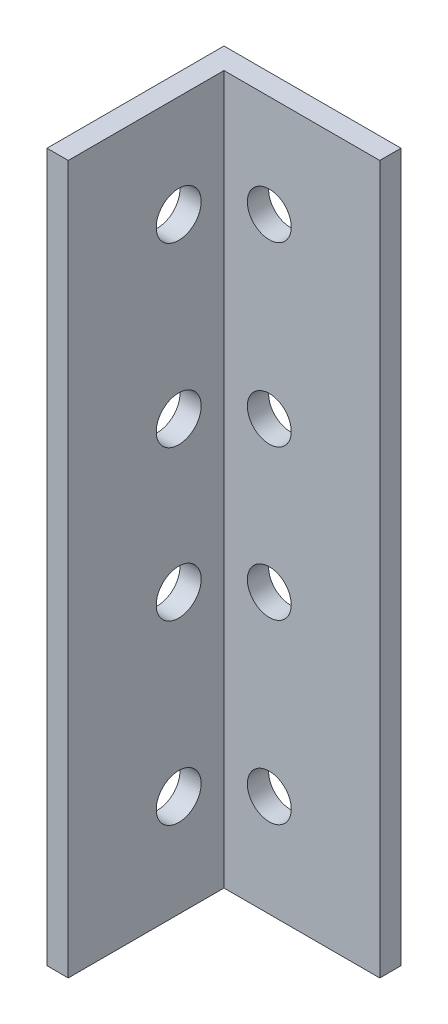
ISO-10303-21;
HEADER;
FILE_DESCRIPTION(('STEP AP214'),'2;1');
FILE_NAME('part.step','',(''),(''),'','','');
FILE_SCHEMA(('AUTOMOTIVE_DESIGN { 1 0 10303 214 1 1 1 1 }'));
ENDSEC;
DATA;
#1=APPLICATION_CONTEXT('core data for automotive mechanical design processes');
#2=APPLICATION_PROTOCOL_DEFINITION('international standard','automotive_design',2000,#1);
#3=PRODUCT_CONTEXT('',#1,'mechanical');
#4=PRODUCT('Part','Part','',(#3));
#5=PRODUCT_RELATED_PRODUCT_CATEGORY('part','',(#4));
#6=PRODUCT_DEFINITION_FORMATION('','',#4);
#7=PRODUCT_DEFINITION_CONTEXT('part definition',#1,'design');
#8=PRODUCT_DEFINITION('design','',#6,#7);
#9=PRODUCT_DEFINITION_SHAPE('','',#8);
#10=(LENGTH_UNIT() NAMED_UNIT(*) SI_UNIT(.MILLI.,.METRE.));
#11=(NAMED_UNIT(*) PLANE_ANGLE_UNIT() SI_UNIT($,.RADIAN.));
#12=(NAMED_UNIT(*) SI_UNIT($,.STERADIAN.) SOLID_ANGLE_UNIT());
#13=UNCERTAINTY_MEASURE_WITH_UNIT(LENGTH_MEASURE(1.E-05),#10,'distance_accuracy_value','');
#14=(GEOMETRIC_REPRESENTATION_CONTEXT(3) GLOBAL_UNCERTAINTY_ASSIGNED_CONTEXT((#13)) GLOBAL_UNIT_ASSIGNED_CONTEXT((#10,
#11,#12)) REPRESENTATION_CONTEXT('',''));
#15=CARTESIAN_POINT('',(0.,0.,0.));
#16=DIRECTION('',(0.,0.,1.));
#17=DIRECTION('',(1.,0.,0.));
#18=AXIS2_PLACEMENT_3D('',#15,#16,#17);
#19=CARTESIAN_POINT('',(-192.,50.,-225.));
#20=DIRECTION('',(0.,-1.,0.));
#21=DIRECTION('',(0.,0.,-1.));
#22=AXIS2_PLACEMENT_3D('',#19,#20,#21);
#23=PLANE('',#22);
#24=DIRECTION('',(-1.,0.,0.));
#25=VECTOR('',#24,1.);
#26=CARTESIAN_POINT('',(-200.,50.,-220.));
#27=LINE('',#26,#25);
#28=CARTESIAN_POINT('',(-170.,50.,-220.));
#29=VERTEX_POINT('',#28);
#30=CARTESIAN_POINT('',(-195.,50.,-220.));
#31=VERTEX_POINT('',#30);
#32=EDGE_CURVE('E157',#29,#31,#27,.T.);
#33=ORIENTED_EDGE('',*,*,#32,.T.);
#34=DIRECTION('',(0.,0.,1.));
#35=VECTOR('',#34,1.);
#36=CARTESIAN_POINT('',(-195.,50.,-225.));
#37=LINE('',#36,#35);
#38=CARTESIAN_POINT('',(-195.,50.,-195.));
#39=VERTEX_POINT('',#38);
#40=EDGE_CURVE('E87',#31,#39,#37,.T.);
#41=ORIENTED_EDGE('',*,*,#40,.T.);
#42=DIRECTION('',(-1.,0.,0.));
#43=VECTOR('',#42,1.);
#44=CARTESIAN_POINT('',(-192.,50.,-195.));
#45=LINE('',#44,#43);
#46=CARTESIAN_POINT('',(-192.,50.,-195.));
#47=VERTEX_POINT('',#46);
#48=EDGE_CURVE('E11',#47,#39,#45,.T.);
#49=ORIENTED_EDGE('',*,*,#48,.F.);
#50=DIRECTION('',(0.,0.,1.));
#51=VECTOR('',#50,1.);
#52=CARTESIAN_POINT('',(-192.,50.,-225.));
#53=LINE('',#52,#51);
#54=CARTESIAN_POINT('',(-192.,50.,-217.));
#55=VERTEX_POINT('',#54);
#56=EDGE_CURVE('E102',#55,#47,#53,.T.);
#57=ORIENTED_EDGE('',*,*,#56,.F.);
#58=DIRECTION('',(-1.,0.,0.));
#59=VECTOR('',#58,1.);
#60=CARTESIAN_POINT('',(-200.,50.,-217.));
#61=LINE('',#60,#59);
#62=CARTESIAN_POINT('',(-170.,50.,-217.));
#63=VERTEX_POINT('',#62);
#64=EDGE_CURVE('E156',#63,#55,#61,.T.);
#65=ORIENTED_EDGE('',*,*,#64,.F.);
#66=DIRECTION('',(0.,0.,-1.));
#67=VECTOR('',#66,1.);
#68=CARTESIAN_POINT('',(-170.,50.,-217.));
#69=LINE('',#68,#67);
#70=EDGE_CURVE('E152',#63,#29,#69,.T.);
#71=ORIENTED_EDGE('',*,*,#70,.T.);
#72=EDGE_LOOP('',(#33,#41,#49,#57,#65,#71));
#73=FACE_BOUND('',#72,.T.);
#74=ADVANCED_FACE('F45',(#73),#23,.F.);
#75=CARTESIAN_POINT('',(-192.,-50.,-225.));
#76=DIRECTION('',(0.,1.,0.));
#77=DIRECTION('',(0.,0.,1.));
#78=AXIS2_PLACEMENT_3D('',#75,#76,#77);
#79=PLANE('',#78);
#80=DIRECTION('',(0.,0.,-1.));
#81=VECTOR('',#80,1.);
#82=CARTESIAN_POINT('',(-195.,-50.,-225.));
#83=LINE('',#82,#81);
#84=CARTESIAN_POINT('',(-195.,-50.,-195.));
#85=VERTEX_POINT('',#84);
#86=CARTESIAN_POINT('',(-195.,-50.,-220.));
#87=VERTEX_POINT('',#86);
#88=EDGE_CURVE('E86',#85,#87,#83,.T.);
#89=ORIENTED_EDGE('',*,*,#88,.T.);
#90=DIRECTION('',(1.,0.,0.));
#91=VECTOR('',#90,1.);
#92=CARTESIAN_POINT('',(-200.,-50.,-220.));
#93=LINE('',#92,#91);
#94=CARTESIAN_POINT('',(-170.,-50.,-220.));
#95=VERTEX_POINT('',#94);
#96=EDGE_CURVE('E166',#87,#95,#93,.T.);
#97=ORIENTED_EDGE('',*,*,#96,.T.);
#98=DIRECTION('',(0.,0.,-1.));
#99=VECTOR('',#98,1.);
#100=CARTESIAN_POINT('',(-170.,-50.,-217.));
#101=LINE('',#100,#99);
#102=CARTESIAN_POINT('',(-170.,-50.,-217.));
#103=VERTEX_POINT('',#102);
#104=EDGE_CURVE('E148',#103,#95,#101,.T.);
#105=ORIENTED_EDGE('',*,*,#104,.F.);
#106=DIRECTION('',(1.,0.,0.));
#107=VECTOR('',#106,1.);
#108=CARTESIAN_POINT('',(-200.,-50.,-217.));
#109=LINE('',#108,#107);
#110=CARTESIAN_POINT('',(-192.,-50.,-217.));
#111=VERTEX_POINT('',#110);
#112=EDGE_CURVE('E161',#111,#103,#109,.T.);
#113=ORIENTED_EDGE('',*,*,#112,.F.);
#114=DIRECTION('',(0.,0.,-1.));
#115=VECTOR('',#114,1.);
#116=CARTESIAN_POINT('',(-192.,-50.,-225.));
#117=LINE('',#116,#115);
#118=CARTESIAN_POINT('',(-192.,-50.,-195.));
#119=VERTEX_POINT('',#118);
#120=EDGE_CURVE('E60',#119,#111,#117,.T.);
#121=ORIENTED_EDGE('',*,*,#120,.F.);
#122=DIRECTION('',(-1.,0.,0.));
#123=VECTOR('',#122,1.);
#124=CARTESIAN_POINT('',(-192.,-50.,-195.));
#125=LINE('',#124,#123);
#126=EDGE_CURVE('E53',#119,#85,#125,.T.);
#127=ORIENTED_EDGE('',*,*,#126,.T.);
#128=EDGE_LOOP('',(#89,#97,#105,#113,#121,#127));
#129=FACE_BOUND('',#128,.T.);
#130=ADVANCED_FACE('F91',(#129),#79,.F.);
#131=CARTESIAN_POINT('',(-192.,0.,0.));
#132=DIRECTION('',(-1.,0.,0.));
#133=DIRECTION('',(0.,0.,1.));
#134=AXIS2_PLACEMENT_3D('',#131,#132,#133);
#135=PLANE('',#134);
#136=CARTESIAN_POINT('',(-192.,-35.6,-210.6));
#137=DIRECTION('',(1.,0.,0.));
#138=DIRECTION('',(0.,0.,-1.));
#139=AXIS2_PLACEMENT_3D('',#136,#137,#138);
#140=CIRCLE('',#139,3.175);
#141=CARTESIAN_POINT('',(-192.,-35.6,-213.775));
#142=VERTEX_POINT('',#141);
#143=EDGE_CURVE('E109',#142,#142,#140,.T.);
#144=ORIENTED_EDGE('',*,*,#143,.F.);
#145=EDGE_LOOP('',(#144));
#146=FACE_BOUND('',#145,.T.);
#147=CARTESIAN_POINT('',(-192.,-10.6,-210.6));
#148=DIRECTION('',(1.,0.,0.));
#149=DIRECTION('',(0.,0.,-1.));
#150=AXIS2_PLACEMENT_3D('',#147,#148,#149);
#151=CIRCLE('',#150,3.175);
#152=CARTESIAN_POINT('',(-192.,-10.6,-213.775));
#153=VERTEX_POINT('',#152);
#154=EDGE_CURVE('E118',#153,#153,#151,.T.);
#155=ORIENTED_EDGE('',*,*,#154,.F.);
#156=EDGE_LOOP('',(#155));
#157=FACE_BOUND('',#156,.T.);
#158=CARTESIAN_POINT('',(-192.,10.6,-210.6));
#159=DIRECTION('',(1.,0.,0.));
#160=DIRECTION('',(0.,0.,-1.));
#161=AXIS2_PLACEMENT_3D('',#158,#159,#160);
#162=CIRCLE('',#161,3.175);
#163=CARTESIAN_POINT('',(-192.,10.6,-213.775));
#164=VERTEX_POINT('',#163);
#165=EDGE_CURVE('E126',#164,#164,#162,.T.);
#166=ORIENTED_EDGE('',*,*,#165,.F.);
#167=EDGE_LOOP('',(#166));
#168=FACE_BOUND('',#167,.T.);
#169=CARTESIAN_POINT('',(-192.,35.6,-210.6));
#170=DIRECTION('',(1.,0.,0.));
#171=DIRECTION('',(0.,0.,-1.));
#172=AXIS2_PLACEMENT_3D('',#169,#170,#171);
#173=CIRCLE('',#172,3.175);
#174=CARTESIAN_POINT('',(-192.,35.6,-213.775));
#175=VERTEX_POINT('',#174);
#176=EDGE_CURVE('E134',#175,#175,#173,.T.);
#177=ORIENTED_EDGE('',*,*,#176,.F.);
#178=EDGE_LOOP('',(#177));
#179=FACE_BOUND('',#178,.T.);
#180=DIRECTION('',(0.,-1.,0.));
#181=VECTOR('',#180,1.);
#182=CARTESIAN_POINT('',(-192.,0.,-217.));
#183=LINE('',#182,#181);
#184=EDGE_CURVE('E142',#55,#111,#183,.T.);
#185=ORIENTED_EDGE('',*,*,#184,.F.);
#186=ORIENTED_EDGE('',*,*,#56,.T.);
#187=DIRECTION('',(0.,-1.,0.));
#188=VECTOR('',#187,1.);
#189=CARTESIAN_POINT('',(-192.,50.,-195.));
#190=LINE('',#189,#188);
#191=EDGE_CURVE('E66',#47,#119,#190,.T.);
#192=ORIENTED_EDGE('',*,*,#191,.T.);
#193=ORIENTED_EDGE('',*,*,#120,.T.);
#194=EDGE_LOOP('',(#185,#186,#192,#193));
#195=FACE_BOUND('',#194,.T.);
#196=ADVANCED_FACE('F262',(#146,#157,#168,#179,#195),#135,.F.);
#197=CARTESIAN_POINT('',(-195.,0.,0.));
#198=DIRECTION('',(-1.,0.,0.));
#199=DIRECTION('',(0.,0.,1.));
#200=AXIS2_PLACEMENT_3D('',#197,#198,#199);
#201=PLANE('',#200);
#202=DIRECTION('',(0.,-1.,0.));
#203=VECTOR('',#202,1.);
#204=CARTESIAN_POINT('',(-195.,70.,-220.));
#205=LINE('',#204,#203);
#206=EDGE_CURVE('E100',#31,#87,#205,.T.);
#207=ORIENTED_EDGE('',*,*,#206,.T.);
#208=ORIENTED_EDGE('',*,*,#88,.F.);
#209=DIRECTION('',(0.,-1.,0.));
#210=VECTOR('',#209,1.);
#211=CARTESIAN_POINT('',(-195.,50.,-195.));
#212=LINE('',#211,#210);
#213=EDGE_CURVE('E78',#39,#85,#212,.T.);
#214=ORIENTED_EDGE('',*,*,#213,.F.);
#215=ORIENTED_EDGE('',*,*,#40,.F.);
#216=EDGE_LOOP('',(#207,#208,#214,#215));
#217=FACE_BOUND('',#216,.T.);
#218=CARTESIAN_POINT('',(-195.,10.6,-210.6));
#219=DIRECTION('',(1.,0.,0.));
#220=DIRECTION('',(0.,0.,-1.));
#221=AXIS2_PLACEMENT_3D('',#218,#219,#220);
#222=CIRCLE('',#221,3.175);
#223=CARTESIAN_POINT('',(-195.,10.6,-213.775));
#224=VERTEX_POINT('',#223);
#225=EDGE_CURVE('E130',#224,#224,#222,.T.);
#226=ORIENTED_EDGE('',*,*,#225,.T.);
#227=EDGE_LOOP('',(#226));
#228=FACE_BOUND('',#227,.T.);
#229=CARTESIAN_POINT('',(-195.,-35.6,-210.6));
#230=DIRECTION('',(1.,0.,0.));
#231=DIRECTION('',(0.,0.,-1.));
#232=AXIS2_PLACEMENT_3D('',#229,#230,#231);
#233=CIRCLE('',#232,3.175);
#234=CARTESIAN_POINT('',(-195.,-35.6,-213.775));
#235=VERTEX_POINT('',#234);
#236=EDGE_CURVE('E114',#235,#235,#233,.T.);
#237=ORIENTED_EDGE('',*,*,#236,.T.);
#238=EDGE_LOOP('',(#237));
#239=FACE_BOUND('',#238,.T.);
#240=CARTESIAN_POINT('',(-195.,-10.6,-210.6));
#241=DIRECTION('',(1.,0.,0.));
#242=DIRECTION('',(0.,0.,-1.));
#243=AXIS2_PLACEMENT_3D('',#240,#241,#242);
#244=CIRCLE('',#243,3.175);
#245=CARTESIAN_POINT('',(-195.,-10.6,-213.775));
#246=VERTEX_POINT('',#245);
#247=EDGE_CURVE('E122',#246,#246,#244,.T.);
#248=ORIENTED_EDGE('',*,*,#247,.T.);
#249=EDGE_LOOP('',(#248));
#250=FACE_BOUND('',#249,.T.);
#251=CARTESIAN_POINT('',(-195.,35.6,-210.6));
#252=DIRECTION('',(1.,0.,0.));
#253=DIRECTION('',(0.,0.,-1.));
#254=AXIS2_PLACEMENT_3D('',#251,#252,#253);
#255=CIRCLE('',#254,3.175);
#256=CARTESIAN_POINT('',(-195.,35.6,-213.775));
#257=VERTEX_POINT('',#256);
#258=EDGE_CURVE('E138',#257,#257,#255,.T.);
#259=ORIENTED_EDGE('',*,*,#258,.T.);
#260=EDGE_LOOP('',(#259));
#261=FACE_BOUND('',#260,.T.);
#262=ADVANCED_FACE('F97',(#217,#228,#239,#250,#261),#201,.T.);
#263=CARTESIAN_POINT('',(-192.,50.,-195.));
#264=DIRECTION('',(0.,0.,-1.));
#265=DIRECTION('',(0.,1.,0.));
#266=AXIS2_PLACEMENT_3D('',#263,#264,#265);
#267=PLANE('',#266);
#268=ORIENTED_EDGE('',*,*,#213,.T.);
#269=ORIENTED_EDGE('',*,*,#126,.F.);
#270=ORIENTED_EDGE('',*,*,#191,.F.);
#271=ORIENTED_EDGE('',*,*,#48,.T.);
#272=EDGE_LOOP('',(#268,#269,#270,#271));
#273=FACE_BOUND('',#272,.T.);
#274=ADVANCED_FACE('F80',(#273),#267,.F.);
#275=CARTESIAN_POINT('',(-192.,-35.6,-210.6));
#276=DIRECTION('',(-1.,0.,0.));
#277=DIRECTION('',(0.,0.,1.));
#278=AXIS2_PLACEMENT_3D('',#275,#276,#277);
#279=CYLINDRICAL_SURFACE('',#278,3.175);
#280=ORIENTED_EDGE('',*,*,#143,.T.);
#281=EDGE_LOOP('',(#280));
#282=FACE_BOUND('',#281,.T.);
#283=ORIENTED_EDGE('',*,*,#236,.F.);
#284=EDGE_LOOP('',(#283));
#285=FACE_BOUND('',#284,.T.);
#286=ADVANCED_FACE('F271',(#282,#285),#279,.F.);
#287=CARTESIAN_POINT('',(-192.,-10.6,-210.6));
#288=DIRECTION('',(-1.,0.,0.));
#289=DIRECTION('',(0.,0.,1.));
#290=AXIS2_PLACEMENT_3D('',#287,#288,#289);
#291=CYLINDRICAL_SURFACE('',#290,3.175);
#292=ORIENTED_EDGE('',*,*,#154,.T.);
#293=EDGE_LOOP('',(#292));
#294=FACE_BOUND('',#293,.T.);
#295=ORIENTED_EDGE('',*,*,#247,.F.);
#296=EDGE_LOOP('',(#295));
#297=FACE_BOUND('',#296,.T.);
#298=ADVANCED_FACE('F275',(#294,#297),#291,.F.);
#299=CARTESIAN_POINT('',(-192.,10.6,-210.6));
#300=DIRECTION('',(-1.,0.,0.));
#301=DIRECTION('',(0.,0.,1.));
#302=AXIS2_PLACEMENT_3D('',#299,#300,#301);
#303=CYLINDRICAL_SURFACE('',#302,3.175);
#304=ORIENTED_EDGE('',*,*,#165,.T.);
#305=EDGE_LOOP('',(#304));
#306=FACE_BOUND('',#305,.T.);
#307=ORIENTED_EDGE('',*,*,#225,.F.);
#308=EDGE_LOOP('',(#307));
#309=FACE_BOUND('',#308,.T.);
#310=ADVANCED_FACE('F377',(#306,#309),#303,.F.);
#311=CARTESIAN_POINT('',(-192.,35.6,-210.6));
#312=DIRECTION('',(-1.,0.,0.));
#313=DIRECTION('',(0.,0.,1.));
#314=AXIS2_PLACEMENT_3D('',#311,#312,#313);
#315=CYLINDRICAL_SURFACE('',#314,3.175);
#316=ORIENTED_EDGE('',*,*,#176,.T.);
#317=EDGE_LOOP('',(#316));
#318=FACE_BOUND('',#317,.T.);
#319=ORIENTED_EDGE('',*,*,#258,.F.);
#320=EDGE_LOOP('',(#319));
#321=FACE_BOUND('',#320,.T.);
#322=ADVANCED_FACE('F221',(#318,#321),#315,.F.);
#323=CARTESIAN_POINT('',(0.,0.,-217.));
#324=DIRECTION('',(0.,0.,-1.));
#325=DIRECTION('',(-1.,0.,0.));
#326=AXIS2_PLACEMENT_3D('',#323,#324,#325);
#327=PLANE('',#326);
#328=CARTESIAN_POINT('',(-185.6,-35.6,-217.));
#329=DIRECTION('',(0.,0.,1.));
#330=DIRECTION('',(1.,0.,0.));
#331=AXIS2_PLACEMENT_3D('',#328,#329,#330);
#332=CIRCLE('',#331,3.09999999999999);
#333=CARTESIAN_POINT('',(-182.5,-35.6,-217.));
#334=VERTEX_POINT('',#333);
#335=EDGE_CURVE('E169',#334,#334,#332,.T.);
#336=ORIENTED_EDGE('',*,*,#335,.F.);
#337=EDGE_LOOP('',(#336));
#338=FACE_BOUND('',#337,.T.);
#339=CARTESIAN_POINT('',(-185.6,-10.6,-217.));
#340=DIRECTION('',(0.,0.,1.));
#341=DIRECTION('',(1.,0.,0.));
#342=AXIS2_PLACEMENT_3D('',#339,#340,#341);
#343=CIRCLE('',#342,3.09999999999999);
#344=CARTESIAN_POINT('',(-182.5,-10.6,-217.));
#345=VERTEX_POINT('',#344);
#346=EDGE_CURVE('E184',#345,#345,#343,.T.);
#347=ORIENTED_EDGE('',*,*,#346,.F.);
#348=EDGE_LOOP('',(#347));
#349=FACE_BOUND('',#348,.T.);
#350=CARTESIAN_POINT('',(-185.599999999999,10.5999999999998,-217.));
#351=DIRECTION('',(0.,0.,1.));
#352=DIRECTION('',(1.,0.,0.));
#353=AXIS2_PLACEMENT_3D('',#350,#351,#352);
#354=CIRCLE('',#353,3.09999999999949);
#355=CARTESIAN_POINT('',(-182.5,10.5999999999998,-217.));
#356=VERTEX_POINT('',#355);
#357=EDGE_CURVE('E192',#356,#356,#354,.T.);
#358=ORIENTED_EDGE('',*,*,#357,.F.);
#359=EDGE_LOOP('',(#358));
#360=FACE_BOUND('',#359,.T.);
#361=CARTESIAN_POINT('',(-185.6,35.6,-217.));
#362=DIRECTION('',(0.,0.,1.));
#363=DIRECTION('',(1.,0.,0.));
#364=AXIS2_PLACEMENT_3D('',#361,#362,#363);
#365=CIRCLE('',#364,3.09999999999999);
#366=CARTESIAN_POINT('',(-182.5,35.6,-217.));
#367=VERTEX_POINT('',#366);
#368=EDGE_CURVE('E200',#367,#367,#365,.T.);
#369=ORIENTED_EDGE('',*,*,#368,.F.);
#370=EDGE_LOOP('',(#369));
#371=FACE_BOUND('',#370,.T.);
#372=ORIENTED_EDGE('',*,*,#64,.T.);
#373=ORIENTED_EDGE('',*,*,#184,.T.);
#374=ORIENTED_EDGE('',*,*,#112,.T.);
#375=DIRECTION('',(0.,1.,0.));
#376=VECTOR('',#375,1.);
#377=CARTESIAN_POINT('',(-170.,-50.,-217.));
#378=LINE('',#377,#376);
#379=EDGE_CURVE('E173',#103,#63,#378,.T.);
#380=ORIENTED_EDGE('',*,*,#379,.T.);
#381=EDGE_LOOP('',(#372,#373,#374,#380));
#382=FACE_BOUND('',#381,.T.);
#383=ADVANCED_FACE('F217',(#338,#349,#360,#371,#382),#327,.F.);
#384=CARTESIAN_POINT('',(0.,0.,-220.));
#385=DIRECTION('',(0.,0.,-1.));
#386=DIRECTION('',(-1.,0.,0.));
#387=AXIS2_PLACEMENT_3D('',#384,#385,#386);
#388=PLANE('',#387);
#389=CARTESIAN_POINT('',(-185.599999999999,10.5999999999998,-220.));
#390=DIRECTION('',(0.,0.,1.));
#391=DIRECTION('',(1.,0.,0.));
#392=AXIS2_PLACEMENT_3D('',#389,#390,#391);
#393=CIRCLE('',#392,3.09999999999949);
#394=CARTESIAN_POINT('',(-182.5,10.5999999999998,-220.));
#395=VERTEX_POINT('',#394);
#396=EDGE_CURVE('E196',#395,#395,#393,.T.);
#397=ORIENTED_EDGE('',*,*,#396,.T.);
#398=EDGE_LOOP('',(#397));
#399=FACE_BOUND('',#398,.T.);
#400=CARTESIAN_POINT('',(-185.6,-35.6,-220.));
#401=DIRECTION('',(0.,0.,1.));
#402=DIRECTION('',(1.,0.,0.));
#403=AXIS2_PLACEMENT_3D('',#400,#401,#402);
#404=CIRCLE('',#403,3.09999999999999);
#405=CARTESIAN_POINT('',(-182.5,-35.6,-220.));
#406=VERTEX_POINT('',#405);
#407=EDGE_CURVE('E180',#406,#406,#404,.T.);
#408=ORIENTED_EDGE('',*,*,#407,.T.);
#409=EDGE_LOOP('',(#408));
#410=FACE_BOUND('',#409,.T.);
#411=CARTESIAN_POINT('',(-185.6,-10.6,-220.));
#412=DIRECTION('',(0.,0.,1.));
#413=DIRECTION('',(1.,0.,0.));
#414=AXIS2_PLACEMENT_3D('',#411,#412,#413);
#415=CIRCLE('',#414,3.09999999999999);
#416=CARTESIAN_POINT('',(-182.5,-10.6,-220.));
#417=VERTEX_POINT('',#416);
#418=EDGE_CURVE('E188',#417,#417,#415,.T.);
#419=ORIENTED_EDGE('',*,*,#418,.T.);
#420=EDGE_LOOP('',(#419));
#421=FACE_BOUND('',#420,.T.);
#422=CARTESIAN_POINT('',(-185.6,35.6,-220.));
#423=DIRECTION('',(0.,0.,1.));
#424=DIRECTION('',(1.,0.,0.));
#425=AXIS2_PLACEMENT_3D('',#422,#423,#424);
#426=CIRCLE('',#425,3.09999999999999);
#427=CARTESIAN_POINT('',(-182.5,35.6,-220.));
#428=VERTEX_POINT('',#427);
#429=EDGE_CURVE('E204',#428,#428,#426,.T.);
#430=ORIENTED_EDGE('',*,*,#429,.T.);
#431=EDGE_LOOP('',(#430));
#432=FACE_BOUND('',#431,.T.);
#433=ORIENTED_EDGE('',*,*,#96,.F.);
#434=ORIENTED_EDGE('',*,*,#206,.F.);
#435=ORIENTED_EDGE('',*,*,#32,.F.);
#436=DIRECTION('',(0.,1.,0.));
#437=VECTOR('',#436,1.);
#438=CARTESIAN_POINT('',(-170.,-50.,-220.));
#439=LINE('',#438,#437);
#440=EDGE_CURVE('E162',#95,#29,#439,.T.);
#441=ORIENTED_EDGE('',*,*,#440,.F.);
#442=EDGE_LOOP('',(#433,#434,#435,#441));
#443=FACE_BOUND('',#442,.T.);
#444=ADVANCED_FACE('F220',(#399,#410,#421,#432,#443),#388,.T.);
#445=CARTESIAN_POINT('',(-170.,-50.,-217.));
#446=DIRECTION('',(-1.,0.,0.));
#447=DIRECTION('',(0.,0.,1.));
#448=AXIS2_PLACEMENT_3D('',#445,#446,#447);
#449=PLANE('',#448);
#450=ORIENTED_EDGE('',*,*,#440,.T.);
#451=ORIENTED_EDGE('',*,*,#70,.F.);
#452=ORIENTED_EDGE('',*,*,#379,.F.);
#453=ORIENTED_EDGE('',*,*,#104,.T.);
#454=EDGE_LOOP('',(#450,#451,#452,#453));
#455=FACE_BOUND('',#454,.T.);
#456=ADVANCED_FACE('F242',(#455),#449,.F.);
#457=CARTESIAN_POINT('',(-185.6,-35.6,-217.));
#458=DIRECTION('',(0.,0.,-1.));
#459=DIRECTION('',(-1.,0.,0.));
#460=AXIS2_PLACEMENT_3D('',#457,#458,#459);
#461=CYLINDRICAL_SURFACE('',#460,3.09999999999999);
#462=ORIENTED_EDGE('',*,*,#335,.T.);
#463=EDGE_LOOP('',(#462));
#464=FACE_BOUND('',#463,.T.);
#465=ORIENTED_EDGE('',*,*,#407,.F.);
#466=EDGE_LOOP('',(#465));
#467=FACE_BOUND('',#466,.T.);
#468=ADVANCED_FACE('F254',(#464,#467),#461,.F.);
#469=CARTESIAN_POINT('',(-185.6,-10.6,-217.));
#470=DIRECTION('',(0.,0.,-1.));
#471=DIRECTION('',(-1.,0.,0.));
#472=AXIS2_PLACEMENT_3D('',#469,#470,#471);
#473=CYLINDRICAL_SURFACE('',#472,3.09999999999999);
#474=ORIENTED_EDGE('',*,*,#346,.T.);
#475=EDGE_LOOP('',(#474));
#476=FACE_BOUND('',#475,.T.);
#477=ORIENTED_EDGE('',*,*,#418,.F.);
#478=EDGE_LOOP('',(#477));
#479=FACE_BOUND('',#478,.T.);
#480=ADVANCED_FACE('F314',(#476,#479),#473,.F.);
#481=CARTESIAN_POINT('',(-185.599999999999,10.5999999999998,-217.));
#482=DIRECTION('',(0.,0.,-1.));
#483=DIRECTION('',(-1.,0.,0.));
#484=AXIS2_PLACEMENT_3D('',#481,#482,#483);
#485=CYLINDRICAL_SURFACE('',#484,3.09999999999949);
#486=ORIENTED_EDGE('',*,*,#357,.T.);
#487=EDGE_LOOP('',(#486));
#488=FACE_BOUND('',#487,.T.);
#489=ORIENTED_EDGE('',*,*,#396,.F.);
#490=EDGE_LOOP('',(#489));
#491=FACE_BOUND('',#490,.T.);
#492=ADVANCED_FACE('F324',(#488,#491),#485,.F.);
#493=CARTESIAN_POINT('',(-185.6,35.6,-217.));
#494=DIRECTION('',(0.,0.,-1.));
#495=DIRECTION('',(-1.,0.,0.));
#496=AXIS2_PLACEMENT_3D('',#493,#494,#495);
#497=CYLINDRICAL_SURFACE('',#496,3.09999999999999);
#498=ORIENTED_EDGE('',*,*,#368,.T.);
#499=EDGE_LOOP('',(#498));
#500=FACE_BOUND('',#499,.T.);
#501=ORIENTED_EDGE('',*,*,#429,.F.);
#502=EDGE_LOOP('',(#501));
#503=FACE_BOUND('',#502,.T.);
#504=ADVANCED_FACE('F214',(#500,#503),#497,.F.);
#505=CLOSED_SHELL('',(#74,#130,#196,#262,#274,#286,#298,#310,#322,#383,#444,#456,#468,#480,#492,#504));
#506=MANIFOLD_SOLID_BREP('B2',#505);
#507=ADVANCED_BREP_SHAPE_REPRESENTATION('',(#18,#506),#14);
#508=SHAPE_DEFINITION_REPRESENTATION(#9,#507);
ENDSEC;
END-ISO-10303-21;
